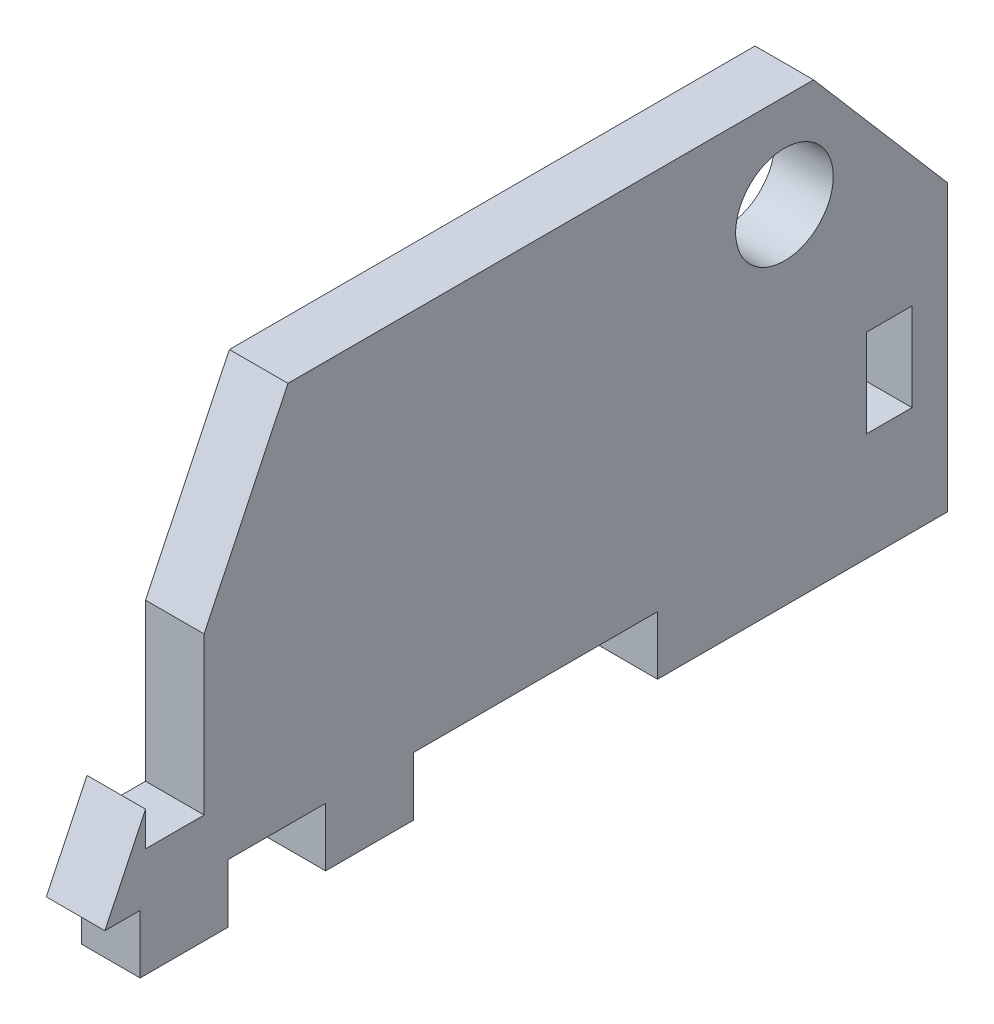
ISO-10303-21;
HEADER;
FILE_DESCRIPTION(('STEP AP214'),'2;1');
FILE_NAME('part.step','',(''),(''),'','','');
FILE_SCHEMA(('AUTOMOTIVE_DESIGN { 1 0 10303 214 1 1 1 1 }'));
ENDSEC;
DATA;
#1=APPLICATION_CONTEXT('core data for automotive mechanical design processes');
#2=APPLICATION_PROTOCOL_DEFINITION('international standard','automotive_design',2000,#1);
#3=PRODUCT_CONTEXT('',#1,'mechanical');
#4=PRODUCT('Part','Part','',(#3));
#5=PRODUCT_RELATED_PRODUCT_CATEGORY('part','',(#4));
#6=PRODUCT_DEFINITION_FORMATION('','',#4);
#7=PRODUCT_DEFINITION_CONTEXT('part definition',#1,'design');
#8=PRODUCT_DEFINITION('design','',#6,#7);
#9=PRODUCT_DEFINITION_SHAPE('','',#8);
#10=(LENGTH_UNIT() NAMED_UNIT(*) SI_UNIT(.MILLI.,.METRE.));
#11=(NAMED_UNIT(*) PLANE_ANGLE_UNIT() SI_UNIT($,.RADIAN.));
#12=(NAMED_UNIT(*) SI_UNIT($,.STERADIAN.) SOLID_ANGLE_UNIT());
#13=UNCERTAINTY_MEASURE_WITH_UNIT(LENGTH_MEASURE(1.E-05),#10,'distance_accuracy_value','');
#14=(GEOMETRIC_REPRESENTATION_CONTEXT(3) GLOBAL_UNCERTAINTY_ASSIGNED_CONTEXT((#13)) GLOBAL_UNIT_ASSIGNED_CONTEXT((#10,
#11,#12)) REPRESENTATION_CONTEXT('',''));
#15=CARTESIAN_POINT('',(0.,0.,0.));
#16=DIRECTION('',(0.,0.,1.));
#17=DIRECTION('',(1.,0.,0.));
#18=AXIS2_PLACEMENT_3D('',#15,#16,#17);
#19=CARTESIAN_POINT('',(6.,14.439304646669,30.1800058494756));
#20=DIRECTION('',(0.,-0.431586578801454,-0.902071518782439));
#21=DIRECTION('',(0.,0.902071518782439,-0.431586578801454));
#22=AXIS2_PLACEMENT_3D('',#19,#20,#21);
#23=PLANE('',#22);
#24=DIRECTION('',(0.,-0.902071518782439,0.431586578801454));
#25=VECTOR('',#24,1.);
#26=CARTESIAN_POINT('',(0.,14.439304646669,30.1800058494756));
#27=LINE('',#26,#25);
#28=CARTESIAN_POINT('',(0.,4.30397298665384,35.0291481015979));
#29=VERTEX_POINT('',#28);
#30=CARTESIAN_POINT('',(0.,-13.6390345379784,43.6137903053747));
#31=VERTEX_POINT('',#30);
#32=EDGE_CURVE('E260',#29,#31,#27,.T.);
#33=ORIENTED_EDGE('',*,*,#32,.T.);
#34=DIRECTION('',(-1.,0.,0.));
#35=VECTOR('',#34,1.);
#36=CARTESIAN_POINT('',(6.,-13.6390345379784,43.6137903053747));
#37=LINE('',#36,#35);
#38=CARTESIAN_POINT('',(6.,-13.6390345379784,43.6137903053747));
#39=VERTEX_POINT('',#38);
#40=EDGE_CURVE('E11',#39,#31,#37,.T.);
#41=ORIENTED_EDGE('',*,*,#40,.F.);
#42=DIRECTION('',(0.,-0.902071518782439,0.431586578801454));
#43=VECTOR('',#42,1.);
#44=CARTESIAN_POINT('',(6.,14.439304646669,30.1800058494756));
#45=LINE('',#44,#43);
#46=CARTESIAN_POINT('',(6.,4.30397298665384,35.0291481015979));
#47=VERTEX_POINT('',#46);
#48=EDGE_CURVE('E382',#47,#39,#45,.T.);
#49=ORIENTED_EDGE('',*,*,#48,.F.);
#50=DIRECTION('',(-1.,0.,0.));
#51=VECTOR('',#50,1.);
#52=CARTESIAN_POINT('',(6.,4.30397298665384,35.0291481015979));
#53=LINE('',#52,#51);
#54=EDGE_CURVE('E307',#47,#29,#53,.T.);
#55=ORIENTED_EDGE('',*,*,#54,.T.);
#56=EDGE_LOOP('',(#33,#41,#49,#55));
#57=FACE_BOUND('',#56,.T.);
#58=ADVANCED_FACE('F43',(#57),#23,.F.);
#59=CARTESIAN_POINT('',(6.,0.,43.6137903053747));
#60=DIRECTION('',(0.,0.,-1.));
#61=DIRECTION('',(-1.,0.,0.));
#62=AXIS2_PLACEMENT_3D('',#59,#60,#61);
#63=PLANE('',#62);
#64=DIRECTION('',(0.,-1.,0.));
#65=VECTOR('',#64,1.);
#66=CARTESIAN_POINT('',(0.,0.,43.6137903053747));
#67=LINE('',#66,#65);
#68=CARTESIAN_POINT('',(0.,-29.7011834849991,43.6137903053747));
#69=VERTEX_POINT('',#68);
#70=EDGE_CURVE('E264',#31,#69,#67,.T.);
#71=ORIENTED_EDGE('',*,*,#70,.T.);
#72=DIRECTION('',(-1.,0.,0.));
#73=VECTOR('',#72,1.);
#74=CARTESIAN_POINT('',(6.,-29.7011834849991,43.6137903053747));
#75=LINE('',#74,#73);
#76=CARTESIAN_POINT('',(6.,-29.7011834849991,43.6137903053747));
#77=VERTEX_POINT('',#76);
#78=EDGE_CURVE('E53',#77,#69,#75,.T.);
#79=ORIENTED_EDGE('',*,*,#78,.F.);
#80=DIRECTION('',(0.,-1.,0.));
#81=VECTOR('',#80,1.);
#82=CARTESIAN_POINT('',(6.,0.,43.6137903053747));
#83=LINE('',#82,#81);
#84=EDGE_CURVE('E391',#39,#77,#83,.T.);
#85=ORIENTED_EDGE('',*,*,#84,.F.);
#86=ORIENTED_EDGE('',*,*,#40,.T.);
#87=EDGE_LOOP('',(#71,#79,#85,#86));
#88=FACE_BOUND('',#87,.T.);
#89=ADVANCED_FACE('F454',(#88),#63,.F.);
#90=CARTESIAN_POINT('',(6.,-29.7011834849991,0.));
#91=DIRECTION('',(0.,1.,0.));
#92=DIRECTION('',(0.,0.,1.));
#93=AXIS2_PLACEMENT_3D('',#90,#91,#92);
#94=PLANE('',#93);
#95=DIRECTION('',(0.,0.,-1.));
#96=VECTOR('',#95,1.);
#97=CARTESIAN_POINT('',(0.,-29.7011834849991,0.));
#98=LINE('',#97,#96);
#99=CARTESIAN_POINT('',(0.,-29.7011834849991,49.6137903053747));
#100=VERTEX_POINT('',#99);
#101=EDGE_CURVE('E269',#100,#69,#98,.T.);
#102=ORIENTED_EDGE('',*,*,#101,.F.);
#103=DIRECTION('',(-1.,0.,0.));
#104=VECTOR('',#103,1.);
#105=CARTESIAN_POINT('',(6.,-29.7011834849991,49.6137903053747));
#106=LINE('',#105,#104);
#107=CARTESIAN_POINT('',(6.,-29.7011834849991,49.6137903053747));
#108=VERTEX_POINT('',#107);
#109=EDGE_CURVE('E351',#108,#100,#106,.T.);
#110=ORIENTED_EDGE('',*,*,#109,.F.);
#111=DIRECTION('',(0.,0.,-1.));
#112=VECTOR('',#111,1.);
#113=CARTESIAN_POINT('',(6.,-29.7011834849991,0.));
#114=LINE('',#113,#112);
#115=EDGE_CURVE('E395',#108,#77,#114,.T.);
#116=ORIENTED_EDGE('',*,*,#115,.T.);
#117=ORIENTED_EDGE('',*,*,#78,.T.);
#118=EDGE_LOOP('',(#102,#110,#116,#117));
#119=FACE_BOUND('',#118,.T.);
#120=ADVANCED_FACE('F460',(#119),#94,.T.);
#121=CARTESIAN_POINT('',(6.,0.,49.6137903053747));
#122=DIRECTION('',(0.,0.,-1.));
#123=DIRECTION('',(-1.,0.,0.));
#124=AXIS2_PLACEMENT_3D('',#121,#122,#123);
#125=PLANE('',#124);
#126=DIRECTION('',(0.,-1.,0.));
#127=VECTOR('',#126,1.);
#128=CARTESIAN_POINT('',(0.,0.,49.6137903053747));
#129=LINE('',#128,#127);
#130=CARTESIAN_POINT('',(0.,-26.1798070701672,49.6137903053747));
#131=VERTEX_POINT('',#130);
#132=EDGE_CURVE('E273',#131,#100,#129,.T.);
#133=ORIENTED_EDGE('',*,*,#132,.F.);
#134=DIRECTION('',(-1.,0.,0.));
#135=VECTOR('',#134,1.);
#136=CARTESIAN_POINT('',(6.,-26.1798070701672,49.6137903053747));
#137=LINE('',#136,#135);
#138=CARTESIAN_POINT('',(6.,-26.1798070701672,49.6137903053747));
#139=VERTEX_POINT('',#138);
#140=EDGE_CURVE('E348',#139,#131,#137,.T.);
#141=ORIENTED_EDGE('',*,*,#140,.F.);
#142=DIRECTION('',(0.,-1.,0.));
#143=VECTOR('',#142,1.);
#144=CARTESIAN_POINT('',(6.,0.,49.6137903053747));
#145=LINE('',#144,#143);
#146=EDGE_CURVE('E399',#139,#108,#145,.T.);
#147=ORIENTED_EDGE('',*,*,#146,.T.);
#148=ORIENTED_EDGE('',*,*,#109,.T.);
#149=EDGE_LOOP('',(#133,#141,#147,#148));
#150=FACE_BOUND('',#149,.T.);
#151=ADVANCED_FACE('F467',(#150),#125,.T.);
#152=CARTESIAN_POINT('',(0.,-34.8813709976453,53.7769615478848));
#153=VERTEX_POINT('',#152);
#154=EDGE_CURVE('E265',#131,#153,#27,.T.);
#155=ORIENTED_EDGE('',*,*,#154,.T.);
#156=DIRECTION('',(-1.,0.,0.));
#157=VECTOR('',#156,1.);
#158=CARTESIAN_POINT('',(6.,-34.8813709976453,53.7769615478848));
#159=LINE('',#158,#157);
#160=CARTESIAN_POINT('',(6.,-34.8813709976453,53.7769615478848));
#161=VERTEX_POINT('',#160);
#162=EDGE_CURVE('E344',#161,#153,#159,.T.);
#163=ORIENTED_EDGE('',*,*,#162,.F.);
#164=EDGE_CURVE('E392',#139,#161,#45,.T.);
#165=ORIENTED_EDGE('',*,*,#164,.F.);
#166=ORIENTED_EDGE('',*,*,#140,.T.);
#167=EDGE_LOOP('',(#155,#163,#165,#166));
#168=FACE_BOUND('',#167,.T.);
#169=ADVANCED_FACE('F456',(#168),#23,.F.);
#170=CARTESIAN_POINT('',(6.,-34.8813709976453,0.));
#171=DIRECTION('',(0.,1.,0.));
#172=DIRECTION('',(0.,0.,1.));
#173=AXIS2_PLACEMENT_3D('',#170,#171,#172);
#174=PLANE('',#173);
#175=DIRECTION('',(0.,0.,-1.));
#176=VECTOR('',#175,1.);
#177=CARTESIAN_POINT('',(0.,-34.8813709976453,0.));
#178=LINE('',#177,#176);
#179=CARTESIAN_POINT('',(0.,-34.8813709976453,50.1671101328036));
#180=VERTEX_POINT('',#179);
#181=EDGE_CURVE('E276',#153,#180,#178,.T.);
#182=ORIENTED_EDGE('',*,*,#181,.T.);
#183=DIRECTION('',(-1.,0.,0.));
#184=VECTOR('',#183,1.);
#185=CARTESIAN_POINT('',(6.,-34.8813709976453,50.1671101328036));
#186=LINE('',#185,#184);
#187=CARTESIAN_POINT('',(6.,-34.8813709976453,50.1671101328036));
#188=VERTEX_POINT('',#187);
#189=EDGE_CURVE('E340',#188,#180,#186,.T.);
#190=ORIENTED_EDGE('',*,*,#189,.F.);
#191=DIRECTION('',(0.,0.,-1.));
#192=VECTOR('',#191,1.);
#193=CARTESIAN_POINT('',(6.,-34.8813709976453,0.));
#194=LINE('',#193,#192);
#195=EDGE_CURVE('E403',#161,#188,#194,.T.);
#196=ORIENTED_EDGE('',*,*,#195,.F.);
#197=ORIENTED_EDGE('',*,*,#162,.T.);
#198=EDGE_LOOP('',(#182,#190,#196,#197));
#199=FACE_BOUND('',#198,.T.);
#200=ADVANCED_FACE('F466',(#199),#174,.F.);
#201=CARTESIAN_POINT('',(6.,0.,50.1671101328036));
#202=DIRECTION('',(0.,0.,-1.));
#203=DIRECTION('',(-1.,0.,0.));
#204=AXIS2_PLACEMENT_3D('',#201,#202,#203);
#205=PLANE('',#204);
#206=DIRECTION('',(0.,-1.,0.));
#207=VECTOR('',#206,1.);
#208=CARTESIAN_POINT('',(0.,0.,50.1671101328036));
#209=LINE('',#208,#207);
#210=CARTESIAN_POINT('',(0.,-40.8813709976453,50.1671101328036));
#211=VERTEX_POINT('',#210);
#212=EDGE_CURVE('E278',#180,#211,#209,.T.);
#213=ORIENTED_EDGE('',*,*,#212,.T.);
#214=DIRECTION('',(-1.,0.,0.));
#215=VECTOR('',#214,1.);
#216=CARTESIAN_POINT('',(6.,-40.8813709976453,50.1671101328036));
#217=LINE('',#216,#215);
#218=CARTESIAN_POINT('',(6.,-40.8813709976453,50.1671101328036));
#219=VERTEX_POINT('',#218);
#220=EDGE_CURVE('E337',#219,#211,#217,.T.);
#221=ORIENTED_EDGE('',*,*,#220,.F.);
#222=DIRECTION('',(0.,-1.,0.));
#223=VECTOR('',#222,1.);
#224=CARTESIAN_POINT('',(6.,0.,50.1671101328036));
#225=LINE('',#224,#223);
#226=EDGE_CURVE('E406',#188,#219,#225,.T.);
#227=ORIENTED_EDGE('',*,*,#226,.F.);
#228=ORIENTED_EDGE('',*,*,#189,.T.);
#229=EDGE_LOOP('',(#213,#221,#227,#228));
#230=FACE_BOUND('',#229,.T.);
#231=ADVANCED_FACE('F473',(#230),#205,.F.);
#232=CARTESIAN_POINT('',(6.,-40.8813709976453,0.));
#233=DIRECTION('',(0.,1.,0.));
#234=DIRECTION('',(0.,0.,1.));
#235=AXIS2_PLACEMENT_3D('',#232,#233,#234);
#236=PLANE('',#235);
#237=DIRECTION('',(0.,0.,-1.));
#238=VECTOR('',#237,1.);
#239=CARTESIAN_POINT('',(0.,-40.8813709976453,0.));
#240=LINE('',#239,#238);
#241=CARTESIAN_POINT('',(0.,-40.8813709976453,41.1671101328036));
#242=VERTEX_POINT('',#241);
#243=EDGE_CURVE('E280',#211,#242,#240,.T.);
#244=ORIENTED_EDGE('',*,*,#243,.T.);
#245=DIRECTION('',(-1.,0.,0.));
#246=VECTOR('',#245,1.);
#247=CARTESIAN_POINT('',(6.,-40.8813709976453,41.1671101328036));
#248=LINE('',#247,#246);
#249=CARTESIAN_POINT('',(6.,-40.8813709976453,41.1671101328036));
#250=VERTEX_POINT('',#249);
#251=EDGE_CURVE('E334',#250,#242,#248,.T.);
#252=ORIENTED_EDGE('',*,*,#251,.F.);
#253=DIRECTION('',(0.,0.,-1.));
#254=VECTOR('',#253,1.);
#255=CARTESIAN_POINT('',(6.,-40.8813709976453,0.));
#256=LINE('',#255,#254);
#257=EDGE_CURVE('E409',#219,#250,#256,.T.);
#258=ORIENTED_EDGE('',*,*,#257,.F.);
#259=ORIENTED_EDGE('',*,*,#220,.T.);
#260=EDGE_LOOP('',(#244,#252,#258,#259));
#261=FACE_BOUND('',#260,.T.);
#262=ADVANCED_FACE('F491',(#261),#236,.F.);
#263=CARTESIAN_POINT('',(6.,0.,41.1671101328036));
#264=DIRECTION('',(0.,0.,1.));
#265=DIRECTION('',(1.,0.,0.));
#266=AXIS2_PLACEMENT_3D('',#263,#264,#265);
#267=PLANE('',#266);
#268=DIRECTION('',(0.,1.,0.));
#269=VECTOR('',#268,1.);
#270=CARTESIAN_POINT('',(0.,0.,41.1671101328036));
#271=LINE('',#270,#269);
#272=CARTESIAN_POINT('',(0.,-34.8813709976453,41.1671101328036));
#273=VERTEX_POINT('',#272);
#274=EDGE_CURVE('E282',#242,#273,#271,.T.);
#275=ORIENTED_EDGE('',*,*,#274,.T.);
#276=DIRECTION('',(-1.,0.,0.));
#277=VECTOR('',#276,1.);
#278=CARTESIAN_POINT('',(6.,-34.8813709976453,41.1671101328036));
#279=LINE('',#278,#277);
#280=CARTESIAN_POINT('',(6.,-34.8813709976453,41.1671101328036));
#281=VERTEX_POINT('',#280);
#282=EDGE_CURVE('E330',#281,#273,#279,.T.);
#283=ORIENTED_EDGE('',*,*,#282,.F.);
#284=DIRECTION('',(0.,1.,0.));
#285=VECTOR('',#284,1.);
#286=CARTESIAN_POINT('',(6.,0.,41.1671101328036));
#287=LINE('',#286,#285);
#288=EDGE_CURVE('E411',#250,#281,#287,.T.);
#289=ORIENTED_EDGE('',*,*,#288,.F.);
#290=ORIENTED_EDGE('',*,*,#251,.T.);
#291=EDGE_LOOP('',(#275,#283,#289,#290));
#292=FACE_BOUND('',#291,.T.);
#293=ADVANCED_FACE('F543',(#292),#267,.F.);
#294=CARTESIAN_POINT('',(6.,-34.8813709976453,0.));
#295=DIRECTION('',(0.,1.,0.));
#296=DIRECTION('',(0.,0.,1.));
#297=AXIS2_PLACEMENT_3D('',#294,#295,#296);
#298=PLANE('',#297);
#299=DIRECTION('',(0.,0.,-1.));
#300=VECTOR('',#299,1.);
#301=CARTESIAN_POINT('',(0.,-34.8813709976453,0.));
#302=LINE('',#301,#300);
#303=CARTESIAN_POINT('',(0.,-34.8813709976453,31.1671101328036));
#304=VERTEX_POINT('',#303);
#305=EDGE_CURVE('E284',#273,#304,#302,.T.);
#306=ORIENTED_EDGE('',*,*,#305,.T.);
#307=DIRECTION('',(-1.,0.,0.));
#308=VECTOR('',#307,1.);
#309=CARTESIAN_POINT('',(6.,-34.8813709976453,31.1671101328036));
#310=LINE('',#309,#308);
#311=CARTESIAN_POINT('',(6.,-34.8813709976453,31.1671101328036));
#312=VERTEX_POINT('',#311);
#313=EDGE_CURVE('E326',#312,#304,#310,.T.);
#314=ORIENTED_EDGE('',*,*,#313,.F.);
#315=DIRECTION('',(0.,0.,-1.));
#316=VECTOR('',#315,1.);
#317=CARTESIAN_POINT('',(6.,-34.8813709976453,0.));
#318=LINE('',#317,#316);
#319=EDGE_CURVE('E414',#281,#312,#318,.T.);
#320=ORIENTED_EDGE('',*,*,#319,.F.);
#321=ORIENTED_EDGE('',*,*,#282,.T.);
#322=EDGE_LOOP('',(#306,#314,#320,#321));
#323=FACE_BOUND('',#322,.T.);
#324=ADVANCED_FACE('F539',(#323),#298,.F.);
#325=CARTESIAN_POINT('',(6.,0.,31.1671101328036));
#326=DIRECTION('',(0.,0.,-1.));
#327=DIRECTION('',(-1.,0.,0.));
#328=AXIS2_PLACEMENT_3D('',#325,#326,#327);
#329=PLANE('',#328);
#330=DIRECTION('',(0.,-1.,0.));
#331=VECTOR('',#330,1.);
#332=CARTESIAN_POINT('',(0.,0.,31.1671101328036));
#333=LINE('',#332,#331);
#334=CARTESIAN_POINT('',(0.,-40.8813709976453,31.1671101328036));
#335=VERTEX_POINT('',#334);
#336=EDGE_CURVE('E286',#304,#335,#333,.T.);
#337=ORIENTED_EDGE('',*,*,#336,.T.);
#338=DIRECTION('',(-1.,0.,0.));
#339=VECTOR('',#338,1.);
#340=CARTESIAN_POINT('',(6.,-40.8813709976453,31.1671101328036));
#341=LINE('',#340,#339);
#342=CARTESIAN_POINT('',(6.,-40.8813709976453,31.1671101328036));
#343=VERTEX_POINT('',#342);
#344=EDGE_CURVE('E322',#343,#335,#341,.T.);
#345=ORIENTED_EDGE('',*,*,#344,.F.);
#346=DIRECTION('',(0.,-1.,0.));
#347=VECTOR('',#346,1.);
#348=CARTESIAN_POINT('',(6.,0.,31.1671101328036));
#349=LINE('',#348,#347);
#350=EDGE_CURVE('E417',#312,#343,#349,.T.);
#351=ORIENTED_EDGE('',*,*,#350,.F.);
#352=ORIENTED_EDGE('',*,*,#313,.T.);
#353=EDGE_LOOP('',(#337,#345,#351,#352));
#354=FACE_BOUND('',#353,.T.);
#355=ADVANCED_FACE('F535',(#354),#329,.F.);
#356=CARTESIAN_POINT('',(6.,-40.8813709976453,0.));
#357=DIRECTION('',(0.,1.,0.));
#358=DIRECTION('',(0.,0.,1.));
#359=AXIS2_PLACEMENT_3D('',#356,#357,#358);
#360=PLANE('',#359);
#361=DIRECTION('',(0.,0.,-1.));
#362=VECTOR('',#361,1.);
#363=CARTESIAN_POINT('',(0.,-40.8813709976453,0.));
#364=LINE('',#363,#362);
#365=CARTESIAN_POINT('',(0.,-40.8813709976453,22.1671101328036));
#366=VERTEX_POINT('',#365);
#367=EDGE_CURVE('E288',#335,#366,#364,.T.);
#368=ORIENTED_EDGE('',*,*,#367,.T.);
#369=DIRECTION('',(-1.,0.,0.));
#370=VECTOR('',#369,1.);
#371=CARTESIAN_POINT('',(6.,-40.8813709976453,22.1671101328036));
#372=LINE('',#371,#370);
#373=CARTESIAN_POINT('',(6.,-40.8813709976453,22.1671101328036));
#374=VERTEX_POINT('',#373);
#375=EDGE_CURVE('E319',#374,#366,#372,.T.);
#376=ORIENTED_EDGE('',*,*,#375,.F.);
#377=DIRECTION('',(0.,0.,-1.));
#378=VECTOR('',#377,1.);
#379=CARTESIAN_POINT('',(6.,-40.8813709976453,0.));
#380=LINE('',#379,#378);
#381=EDGE_CURVE('E420',#343,#374,#380,.T.);
#382=ORIENTED_EDGE('',*,*,#381,.F.);
#383=ORIENTED_EDGE('',*,*,#344,.T.);
#384=EDGE_LOOP('',(#368,#376,#382,#383));
#385=FACE_BOUND('',#384,.T.);
#386=ADVANCED_FACE('F531',(#385),#360,.F.);
#387=CARTESIAN_POINT('',(6.,0.,22.1671101328036));
#388=DIRECTION('',(0.,0.,1.));
#389=DIRECTION('',(1.,0.,0.));
#390=AXIS2_PLACEMENT_3D('',#387,#388,#389);
#391=PLANE('',#390);
#392=DIRECTION('',(0.,1.,0.));
#393=VECTOR('',#392,1.);
#394=CARTESIAN_POINT('',(0.,0.,22.1671101328036));
#395=LINE('',#394,#393);
#396=CARTESIAN_POINT('',(0.,-34.8813709976453,22.1671101328036));
#397=VERTEX_POINT('',#396);
#398=EDGE_CURVE('E291',#366,#397,#395,.T.);
#399=ORIENTED_EDGE('',*,*,#398,.T.);
#400=DIRECTION('',(-1.,0.,0.));
#401=VECTOR('',#400,1.);
#402=CARTESIAN_POINT('',(6.,-34.8813709976453,22.1671101328036));
#403=LINE('',#402,#401);
#404=CARTESIAN_POINT('',(6.,-34.8813709976453,22.1671101328036));
#405=VERTEX_POINT('',#404);
#406=EDGE_CURVE('E316',#405,#397,#403,.T.);
#407=ORIENTED_EDGE('',*,*,#406,.F.);
#408=DIRECTION('',(0.,1.,0.));
#409=VECTOR('',#408,1.);
#410=CARTESIAN_POINT('',(6.,0.,22.1671101328036));
#411=LINE('',#410,#409);
#412=EDGE_CURVE('E423',#374,#405,#411,.T.);
#413=ORIENTED_EDGE('',*,*,#412,.F.);
#414=ORIENTED_EDGE('',*,*,#375,.T.);
#415=EDGE_LOOP('',(#399,#407,#413,#414));
#416=FACE_BOUND('',#415,.T.);
#417=ADVANCED_FACE('F527',(#416),#391,.F.);
#418=CARTESIAN_POINT('',(6.,-34.8813709976453,0.));
#419=DIRECTION('',(0.,1.,0.));
#420=DIRECTION('',(0.,0.,1.));
#421=AXIS2_PLACEMENT_3D('',#418,#419,#420);
#422=PLANE('',#421);
#423=DIRECTION('',(0.,0.,-1.));
#424=VECTOR('',#423,1.);
#425=CARTESIAN_POINT('',(0.,-34.8813709976453,0.));
#426=LINE('',#425,#424);
#427=CARTESIAN_POINT('',(0.,-34.8813709976453,-2.83288986719636));
#428=VERTEX_POINT('',#427);
#429=EDGE_CURVE('E293',#397,#428,#426,.T.);
#430=ORIENTED_EDGE('',*,*,#429,.T.);
#431=DIRECTION('',(-1.,0.,0.));
#432=VECTOR('',#431,1.);
#433=CARTESIAN_POINT('',(6.,-34.8813709976453,-2.83288986719636));
#434=LINE('',#433,#432);
#435=CARTESIAN_POINT('',(6.,-34.8813709976453,-2.83288986719636));
#436=VERTEX_POINT('',#435);
#437=EDGE_CURVE('E313',#436,#428,#434,.T.);
#438=ORIENTED_EDGE('',*,*,#437,.F.);
#439=DIRECTION('',(0.,0.,-1.));
#440=VECTOR('',#439,1.);
#441=CARTESIAN_POINT('',(6.,-34.8813709976453,0.));
#442=LINE('',#441,#440);
#443=EDGE_CURVE('E425',#405,#436,#442,.T.);
#444=ORIENTED_EDGE('',*,*,#443,.F.);
#445=ORIENTED_EDGE('',*,*,#406,.T.);
#446=EDGE_LOOP('',(#430,#438,#444,#445));
#447=FACE_BOUND('',#446,.T.);
#448=ADVANCED_FACE('F524',(#447),#422,.F.);
#449=CARTESIAN_POINT('',(6.,0.,-2.83288986719636));
#450=DIRECTION('',(0.,0.,-1.));
#451=DIRECTION('',(0.,1.,0.));
#452=AXIS2_PLACEMENT_3D('',#449,#450,#451);
#453=PLANE('',#452);
#454=DIRECTION('',(0.,-1.,0.));
#455=VECTOR('',#454,1.);
#456=CARTESIAN_POINT('',(0.,0.,-2.83288986719636));
#457=LINE('',#456,#455);
#458=CARTESIAN_POINT('',(0.,-40.8813709976453,-2.83288986719637));
#459=VERTEX_POINT('',#458);
#460=EDGE_CURVE('E296',#428,#459,#457,.T.);
#461=ORIENTED_EDGE('',*,*,#460,.T.);
#462=DIRECTION('',(-1.,0.,0.));
#463=VECTOR('',#462,1.);
#464=CARTESIAN_POINT('',(6.,-40.8813709976453,-2.83288986719637));
#465=LINE('',#464,#463);
#466=CARTESIAN_POINT('',(6.,-40.8813709976453,-2.83288986719637));
#467=VERTEX_POINT('',#466);
#468=EDGE_CURVE('E311',#467,#459,#465,.T.);
#469=ORIENTED_EDGE('',*,*,#468,.F.);
#470=DIRECTION('',(0.,-1.,0.));
#471=VECTOR('',#470,1.);
#472=CARTESIAN_POINT('',(6.,0.,-2.83288986719636));
#473=LINE('',#472,#471);
#474=EDGE_CURVE('E238',#436,#467,#473,.T.);
#475=ORIENTED_EDGE('',*,*,#474,.F.);
#476=ORIENTED_EDGE('',*,*,#437,.T.);
#477=EDGE_LOOP('',(#461,#469,#475,#476));
#478=FACE_BOUND('',#477,.T.);
#479=ADVANCED_FACE('F432',(#478),#453,.F.);
#480=CARTESIAN_POINT('',(6.,-40.8813709976453,0.));
#481=DIRECTION('',(0.,-1.,0.));
#482=DIRECTION('',(0.,0.,-1.));
#483=AXIS2_PLACEMENT_3D('',#480,#481,#482);
#484=PLANE('',#483);
#485=DIRECTION('',(0.,0.,1.));
#486=VECTOR('',#485,1.);
#487=CARTESIAN_POINT('',(0.,-40.8813709976453,0.));
#488=LINE('',#487,#486);
#489=CARTESIAN_POINT('',(0.,-40.8813709976453,-32.5528975457962));
#490=VERTEX_POINT('',#489);
#491=EDGE_CURVE('E299',#490,#459,#488,.T.);
#492=ORIENTED_EDGE('',*,*,#491,.F.);
#493=DIRECTION('',(-1.,0.,0.));
#494=VECTOR('',#493,1.);
#495=CARTESIAN_POINT('',(6.,-40.8813709976453,-32.5528975457962));
#496=LINE('',#495,#494);
#497=CARTESIAN_POINT('',(6.,-40.8813709976453,-32.5528975457962));
#498=VERTEX_POINT('',#497);
#499=EDGE_CURVE('E226',#498,#490,#496,.T.);
#500=ORIENTED_EDGE('',*,*,#499,.F.);
#501=DIRECTION('',(0.,0.,1.));
#502=VECTOR('',#501,1.);
#503=CARTESIAN_POINT('',(6.,-40.8813709976453,0.));
#504=LINE('',#503,#502);
#505=EDGE_CURVE('E235',#498,#467,#504,.T.);
#506=ORIENTED_EDGE('',*,*,#505,.T.);
#507=ORIENTED_EDGE('',*,*,#468,.T.);
#508=EDGE_LOOP('',(#492,#500,#506,#507));
#509=FACE_BOUND('',#508,.T.);
#510=ADVANCED_FACE('F436',(#509),#484,.T.);
#511=CARTESIAN_POINT('',(6.,0.,-32.5528975457962));
#512=DIRECTION('',(0.,0.,-1.));
#513=DIRECTION('',(0.,1.,0.));
#514=AXIS2_PLACEMENT_3D('',#511,#512,#513);
#515=PLANE('',#514);
#516=DIRECTION('',(0.,-1.,0.));
#517=VECTOR('',#516,1.);
#518=CARTESIAN_POINT('',(0.,0.,-32.5528975457962));
#519=LINE('',#518,#517);
#520=CARTESIAN_POINT('',(0.,-11.7009578056944,-32.5528975457962));
#521=VERTEX_POINT('',#520);
#522=EDGE_CURVE('E225',#521,#490,#519,.T.);
#523=ORIENTED_EDGE('',*,*,#522,.F.);
#524=DIRECTION('',(-1.,0.,0.));
#525=VECTOR('',#524,1.);
#526=CARTESIAN_POINT('',(6.,-11.7009578056944,-32.5528975457962));
#527=LINE('',#526,#525);
#528=CARTESIAN_POINT('',(6.,-11.7009578056944,-32.5528975457962));
#529=VERTEX_POINT('',#528);
#530=EDGE_CURVE('E219',#529,#521,#527,.T.);
#531=ORIENTED_EDGE('',*,*,#530,.F.);
#532=DIRECTION('',(0.,-1.,0.));
#533=VECTOR('',#532,1.);
#534=CARTESIAN_POINT('',(6.,0.,-32.5528975457962));
#535=LINE('',#534,#533);
#536=EDGE_CURVE('E223',#529,#498,#535,.T.);
#537=ORIENTED_EDGE('',*,*,#536,.T.);
#538=ORIENTED_EDGE('',*,*,#499,.T.);
#539=EDGE_LOOP('',(#523,#531,#537,#538));
#540=FACE_BOUND('',#539,.T.);
#541=ADVANCED_FACE('F221',(#540),#515,.T.);
#542=CARTESIAN_POINT('',(6.,11.1260459907032,-12.9675984305437));
#543=DIRECTION('',(0.,-0.651161124071979,0.758939517021822));
#544=DIRECTION('',(0.,-0.758939517021822,-0.651161124071979));
#545=AXIS2_PLACEMENT_3D('',#542,#543,#544);
#546=PLANE('',#545);
#547=DIRECTION('',(0.,0.758939517021822,0.651161124071979));
#548=VECTOR('',#547,1.);
#549=CARTESIAN_POINT('',(0.,11.1260459907032,-12.9675984305437));
#550=LINE('',#549,#548);
#551=CARTESIAN_POINT('',(0.,4.30397298665385,-18.8208563334264));
#552=VERTEX_POINT('',#551);
#553=EDGE_CURVE('E136',#521,#552,#550,.T.);
#554=ORIENTED_EDGE('',*,*,#553,.T.);
#555=DIRECTION('',(-1.,0.,0.));
#556=VECTOR('',#555,1.);
#557=CARTESIAN_POINT('',(6.,4.30397298665385,-18.8208563334264));
#558=LINE('',#557,#556);
#559=CARTESIAN_POINT('',(6.,4.30397298665385,-18.8208563334264));
#560=VERTEX_POINT('',#559);
#561=EDGE_CURVE('E227',#560,#552,#558,.T.);
#562=ORIENTED_EDGE('',*,*,#561,.F.);
#563=DIRECTION('',(0.,0.758939517021822,0.651161124071979));
#564=VECTOR('',#563,1.);
#565=CARTESIAN_POINT('',(6.,11.1260459907032,-12.9675984305437));
#566=LINE('',#565,#564);
#567=EDGE_CURVE('E229',#529,#560,#566,.T.);
#568=ORIENTED_EDGE('',*,*,#567,.F.);
#569=ORIENTED_EDGE('',*,*,#530,.T.);
#570=EDGE_LOOP('',(#554,#562,#568,#569));
#571=FACE_BOUND('',#570,.T.);
#572=ADVANCED_FACE('F230',(#571),#546,.F.);
#573=CARTESIAN_POINT('',(6.,0.,-28.898723615905));
#574=DIRECTION('',(0.,0.,1.));
#575=DIRECTION('',(1.,0.,0.));
#576=AXIS2_PLACEMENT_3D('',#573,#574,#575);
#577=PLANE('',#576);
#578=DIRECTION('',(0.,1.,0.));
#579=VECTOR('',#578,1.);
#580=CARTESIAN_POINT('',(0.,0.,-28.898723615905));
#581=LINE('',#580,#579);
#582=CARTESIAN_POINT('',(0.,-29.8153764203083,-28.898723615905));
#583=VERTEX_POINT('',#582);
#584=CARTESIAN_POINT('',(0.,-20.7941345308892,-28.898723615905));
#585=VERTEX_POINT('',#584);
#586=EDGE_CURVE('E248',#583,#585,#581,.T.);
#587=ORIENTED_EDGE('',*,*,#586,.F.);
#588=DIRECTION('',(-1.,0.,0.));
#589=VECTOR('',#588,1.);
#590=CARTESIAN_POINT('',(6.,-29.8153764203083,-28.898723615905));
#591=LINE('',#590,#589);
#592=CARTESIAN_POINT('',(6.,-29.8153764203083,-28.898723615905));
#593=VERTEX_POINT('',#592);
#594=EDGE_CURVE('E47',#593,#583,#591,.T.);
#595=ORIENTED_EDGE('',*,*,#594,.F.);
#596=DIRECTION('',(0.,1.,0.));
#597=VECTOR('',#596,1.);
#598=CARTESIAN_POINT('',(6.,0.,-28.898723615905));
#599=LINE('',#598,#597);
#600=CARTESIAN_POINT('',(6.,-20.7941345308892,-28.898723615905));
#601=VERTEX_POINT('',#600);
#602=EDGE_CURVE('E385',#593,#601,#599,.T.);
#603=ORIENTED_EDGE('',*,*,#602,.T.);
#604=DIRECTION('',(-1.,0.,0.));
#605=VECTOR('',#604,1.);
#606=CARTESIAN_POINT('',(6.,-20.7941345308892,-28.898723615905));
#607=LINE('',#606,#605);
#608=EDGE_CURVE('E244',#601,#585,#607,.T.);
#609=ORIENTED_EDGE('',*,*,#608,.T.);
#610=EDGE_LOOP('',(#587,#595,#603,#609));
#611=FACE_BOUND('',#610,.T.);
#612=ADVANCED_FACE('F369',(#611),#577,.T.);
#613=CARTESIAN_POINT('',(6.,-29.8153764203083,0.));
#614=DIRECTION('',(0.,1.,0.));
#615=DIRECTION('',(0.,0.,1.));
#616=AXIS2_PLACEMENT_3D('',#613,#614,#615);
#617=PLANE('',#616);
#618=DIRECTION('',(0.,0.,-1.));
#619=VECTOR('',#618,1.);
#620=CARTESIAN_POINT('',(0.,-29.8153764203083,0.));
#621=LINE('',#620,#619);
#622=CARTESIAN_POINT('',(0.,-29.8153764203083,-24.2168132682318));
#623=VERTEX_POINT('',#622);
#624=EDGE_CURVE('E251',#623,#583,#621,.T.);
#625=ORIENTED_EDGE('',*,*,#624,.F.);
#626=DIRECTION('',(-1.,0.,0.));
#627=VECTOR('',#626,1.);
#628=CARTESIAN_POINT('',(6.,-29.8153764203083,-24.2168132682318));
#629=LINE('',#628,#627);
#630=CARTESIAN_POINT('',(6.,-29.8153764203083,-24.2168132682318));
#631=VERTEX_POINT('',#630);
#632=EDGE_CURVE('E359',#631,#623,#629,.T.);
#633=ORIENTED_EDGE('',*,*,#632,.F.);
#634=DIRECTION('',(0.,0.,-1.));
#635=VECTOR('',#634,1.);
#636=CARTESIAN_POINT('',(6.,-29.8153764203083,0.));
#637=LINE('',#636,#635);
#638=EDGE_CURVE('E368',#631,#593,#637,.T.);
#639=ORIENTED_EDGE('',*,*,#638,.T.);
#640=ORIENTED_EDGE('',*,*,#594,.T.);
#641=EDGE_LOOP('',(#625,#633,#639,#640));
#642=FACE_BOUND('',#641,.T.);
#643=ADVANCED_FACE('F366',(#642),#617,.T.);
#644=CARTESIAN_POINT('',(6.,0.,-24.2168132682318));
#645=DIRECTION('',(0.,0.,1.));
#646=DIRECTION('',(1.,0.,0.));
#647=AXIS2_PLACEMENT_3D('',#644,#645,#646);
#648=PLANE('',#647);
#649=DIRECTION('',(0.,1.,0.));
#650=VECTOR('',#649,1.);
#651=CARTESIAN_POINT('',(0.,0.,-24.2168132682318));
#652=LINE('',#651,#650);
#653=CARTESIAN_POINT('',(0.,-20.7941345308892,-24.2168132682318));
#654=VERTEX_POINT('',#653);
#655=EDGE_CURVE('E254',#623,#654,#652,.T.);
#656=ORIENTED_EDGE('',*,*,#655,.T.);
#657=DIRECTION('',(-1.,0.,0.));
#658=VECTOR('',#657,1.);
#659=CARTESIAN_POINT('',(6.,-20.7941345308892,-24.2168132682318));
#660=LINE('',#659,#658);
#661=CARTESIAN_POINT('',(6.,-20.7941345308892,-24.2168132682318));
#662=VERTEX_POINT('',#661);
#663=EDGE_CURVE('E357',#662,#654,#660,.T.);
#664=ORIENTED_EDGE('',*,*,#663,.F.);
#665=DIRECTION('',(0.,1.,0.));
#666=VECTOR('',#665,1.);
#667=CARTESIAN_POINT('',(6.,0.,-24.2168132682318));
#668=LINE('',#667,#666);
#669=EDGE_CURVE('E377',#631,#662,#668,.T.);
#670=ORIENTED_EDGE('',*,*,#669,.F.);
#671=ORIENTED_EDGE('',*,*,#632,.T.);
#672=EDGE_LOOP('',(#656,#664,#670,#671));
#673=FACE_BOUND('',#672,.T.);
#674=ADVANCED_FACE('F375',(#673),#648,.F.);
#675=CARTESIAN_POINT('',(6.,-20.7941345308892,0.));
#676=DIRECTION('',(0.,1.,0.));
#677=DIRECTION('',(0.,0.,1.));
#678=AXIS2_PLACEMENT_3D('',#675,#676,#677);
#679=PLANE('',#678);
#680=DIRECTION('',(0.,0.,-1.));
#681=VECTOR('',#680,1.);
#682=CARTESIAN_POINT('',(0.,-20.7941345308892,0.));
#683=LINE('',#682,#681);
#684=EDGE_CURVE('E257',#654,#585,#683,.T.);
#685=ORIENTED_EDGE('',*,*,#684,.T.);
#686=ORIENTED_EDGE('',*,*,#608,.F.);
#687=DIRECTION('',(0.,0.,-1.));
#688=VECTOR('',#687,1.);
#689=CARTESIAN_POINT('',(6.,-20.7941345308892,0.));
#690=LINE('',#689,#688);
#691=EDGE_CURVE('E380',#662,#601,#690,.T.);
#692=ORIENTED_EDGE('',*,*,#691,.F.);
#693=ORIENTED_EDGE('',*,*,#663,.T.);
#694=EDGE_LOOP('',(#685,#686,#692,#693));
#695=FACE_BOUND('',#694,.T.);
#696=ADVANCED_FACE('F379',(#695),#679,.F.);
#697=CARTESIAN_POINT('',(6.,-5.26389532885136,-15.8328898671964));
#698=DIRECTION('',(-1.,0.,0.));
#699=DIRECTION('',(0.,0.,1.));
#700=AXIS2_PLACEMENT_3D('',#697,#698,#699);
#701=CYLINDRICAL_SURFACE('',#700,5.);
#702=CARTESIAN_POINT('',(6.,-5.26389532885136,-15.8328898671964));
#703=DIRECTION('',(1.,0.,0.));
#704=DIRECTION('',(0.,0.,-1.));
#705=AXIS2_PLACEMENT_3D('',#702,#703,#704);
#706=CIRCLE('',#705,5.);
#707=CARTESIAN_POINT('',(6.,-5.26389532885136,-20.8328898671964));
#708=VERTEX_POINT('',#707);
#709=EDGE_CURVE('E306',#708,#708,#706,.T.);
#710=ORIENTED_EDGE('',*,*,#709,.T.);
#711=EDGE_LOOP('',(#710));
#712=FACE_BOUND('',#711,.T.);
#713=CARTESIAN_POINT('',(0.,-5.26389532885136,-15.8328898671964));
#714=DIRECTION('',(1.,0.,0.));
#715=DIRECTION('',(0.,0.,-1.));
#716=AXIS2_PLACEMENT_3D('',#713,#714,#715);
#717=CIRCLE('',#716,5.);
#718=CARTESIAN_POINT('',(0.,-5.26389532885136,-20.8328898671964));
#719=VERTEX_POINT('',#718);
#720=EDGE_CURVE('E245',#719,#719,#717,.T.);
#721=ORIENTED_EDGE('',*,*,#720,.F.);
#722=EDGE_LOOP('',(#721));
#723=FACE_BOUND('',#722,.T.);
#724=ADVANCED_FACE('F45',(#712,#723),#701,.F.);
#725=CARTESIAN_POINT('',(6.,4.30397298665385,0.));
#726=DIRECTION('',(0.,-1.,0.));
#727=DIRECTION('',(0.,0.,-1.));
#728=AXIS2_PLACEMENT_3D('',#725,#726,#727);
#729=PLANE('',#728);
#730=DIRECTION('',(0.,0.,1.));
#731=VECTOR('',#730,1.);
#732=CARTESIAN_POINT('',(0.,4.30397298665385,0.));
#733=LINE('',#732,#731);
#734=EDGE_CURVE('E142',#552,#29,#733,.T.);
#735=ORIENTED_EDGE('',*,*,#734,.T.);
#736=ORIENTED_EDGE('',*,*,#54,.F.);
#737=DIRECTION('',(0.,0.,1.));
#738=VECTOR('',#737,1.);
#739=CARTESIAN_POINT('',(6.,4.30397298665385,0.));
#740=LINE('',#739,#738);
#741=EDGE_CURVE('E62',#560,#47,#740,.T.);
#742=ORIENTED_EDGE('',*,*,#741,.F.);
#743=ORIENTED_EDGE('',*,*,#561,.T.);
#744=EDGE_LOOP('',(#735,#736,#742,#743));
#745=FACE_BOUND('',#744,.T.);
#746=ADVANCED_FACE('F441',(#745),#729,.F.);
#747=CARTESIAN_POINT('',(6.,0.,0.));
#748=DIRECTION('',(1.,0.,0.));
#749=DIRECTION('',(0.,0.,-1.));
#750=AXIS2_PLACEMENT_3D('',#747,#748,#749);
#751=PLANE('',#750);
#752=ORIENTED_EDGE('',*,*,#709,.F.);
#753=EDGE_LOOP('',(#752));
#754=FACE_BOUND('',#753,.T.);
#755=ORIENTED_EDGE('',*,*,#602,.F.);
#756=ORIENTED_EDGE('',*,*,#638,.F.);
#757=ORIENTED_EDGE('',*,*,#669,.T.);
#758=ORIENTED_EDGE('',*,*,#691,.T.);
#759=EDGE_LOOP('',(#755,#756,#757,#758));
#760=FACE_BOUND('',#759,.T.);
#761=ORIENTED_EDGE('',*,*,#48,.T.);
#762=ORIENTED_EDGE('',*,*,#84,.T.);
#763=ORIENTED_EDGE('',*,*,#115,.F.);
#764=ORIENTED_EDGE('',*,*,#146,.F.);
#765=ORIENTED_EDGE('',*,*,#164,.T.);
#766=ORIENTED_EDGE('',*,*,#195,.T.);
#767=ORIENTED_EDGE('',*,*,#226,.T.);
#768=ORIENTED_EDGE('',*,*,#257,.T.);
#769=ORIENTED_EDGE('',*,*,#288,.T.);
#770=ORIENTED_EDGE('',*,*,#319,.T.);
#771=ORIENTED_EDGE('',*,*,#350,.T.);
#772=ORIENTED_EDGE('',*,*,#381,.T.);
#773=ORIENTED_EDGE('',*,*,#412,.T.);
#774=ORIENTED_EDGE('',*,*,#443,.T.);
#775=ORIENTED_EDGE('',*,*,#474,.T.);
#776=ORIENTED_EDGE('',*,*,#505,.F.);
#777=ORIENTED_EDGE('',*,*,#536,.F.);
#778=ORIENTED_EDGE('',*,*,#567,.T.);
#779=ORIENTED_EDGE('',*,*,#741,.T.);
#780=EDGE_LOOP('',(#761,#762,#763,#764,#765,#766,#767,#768,#769,#770,#771,#772,#773,#774,#775,
#776,#777,#778,#779));
#781=FACE_BOUND('',#780,.T.);
#782=ADVANCED_FACE('F233',(#754,#760,#781),#751,.T.);
#783=CARTESIAN_POINT('',(0.,0.,0.));
#784=DIRECTION('',(1.,0.,0.));
#785=DIRECTION('',(0.,0.,-1.));
#786=AXIS2_PLACEMENT_3D('',#783,#784,#785);
#787=PLANE('',#786);
#788=ORIENTED_EDGE('',*,*,#720,.T.);
#789=EDGE_LOOP('',(#788));
#790=FACE_BOUND('',#789,.T.);
#791=ORIENTED_EDGE('',*,*,#586,.T.);
#792=ORIENTED_EDGE('',*,*,#684,.F.);
#793=ORIENTED_EDGE('',*,*,#655,.F.);
#794=ORIENTED_EDGE('',*,*,#624,.T.);
#795=EDGE_LOOP('',(#791,#792,#793,#794));
#796=FACE_BOUND('',#795,.T.);
#797=ORIENTED_EDGE('',*,*,#32,.F.);
#798=ORIENTED_EDGE('',*,*,#734,.F.);
#799=ORIENTED_EDGE('',*,*,#553,.F.);
#800=ORIENTED_EDGE('',*,*,#522,.T.);
#801=ORIENTED_EDGE('',*,*,#491,.T.);
#802=ORIENTED_EDGE('',*,*,#460,.F.);
#803=ORIENTED_EDGE('',*,*,#429,.F.);
#804=ORIENTED_EDGE('',*,*,#398,.F.);
#805=ORIENTED_EDGE('',*,*,#367,.F.);
#806=ORIENTED_EDGE('',*,*,#336,.F.);
#807=ORIENTED_EDGE('',*,*,#305,.F.);
#808=ORIENTED_EDGE('',*,*,#274,.F.);
#809=ORIENTED_EDGE('',*,*,#243,.F.);
#810=ORIENTED_EDGE('',*,*,#212,.F.);
#811=ORIENTED_EDGE('',*,*,#181,.F.);
#812=ORIENTED_EDGE('',*,*,#154,.F.);
#813=ORIENTED_EDGE('',*,*,#132,.T.);
#814=ORIENTED_EDGE('',*,*,#101,.T.);
#815=ORIENTED_EDGE('',*,*,#70,.F.);
#816=EDGE_LOOP('',(#797,#798,#799,#800,#801,#802,#803,#804,#805,#806,#807,#808,#809,#810,#811,
#812,#813,#814,#815));
#817=FACE_BOUND('',#816,.T.);
#818=ADVANCED_FACE('F372',(#790,#796,#817),#787,.F.);
#819=CLOSED_SHELL('',(#58,#89,#120,#151,#169,#200,#231,#262,#293,#324,#355,#386,#417,#448,#479,
#510,#541,#572,#612,#643,#674,#696,#724,#746,#782,#818));
#820=MANIFOLD_SOLID_BREP('B2',#819);
#821=ADVANCED_BREP_SHAPE_REPRESENTATION('',(#18,#820),#14);
#822=SHAPE_DEFINITION_REPRESENTATION(#9,#821);
ENDSEC;
END-ISO-10303-21;
